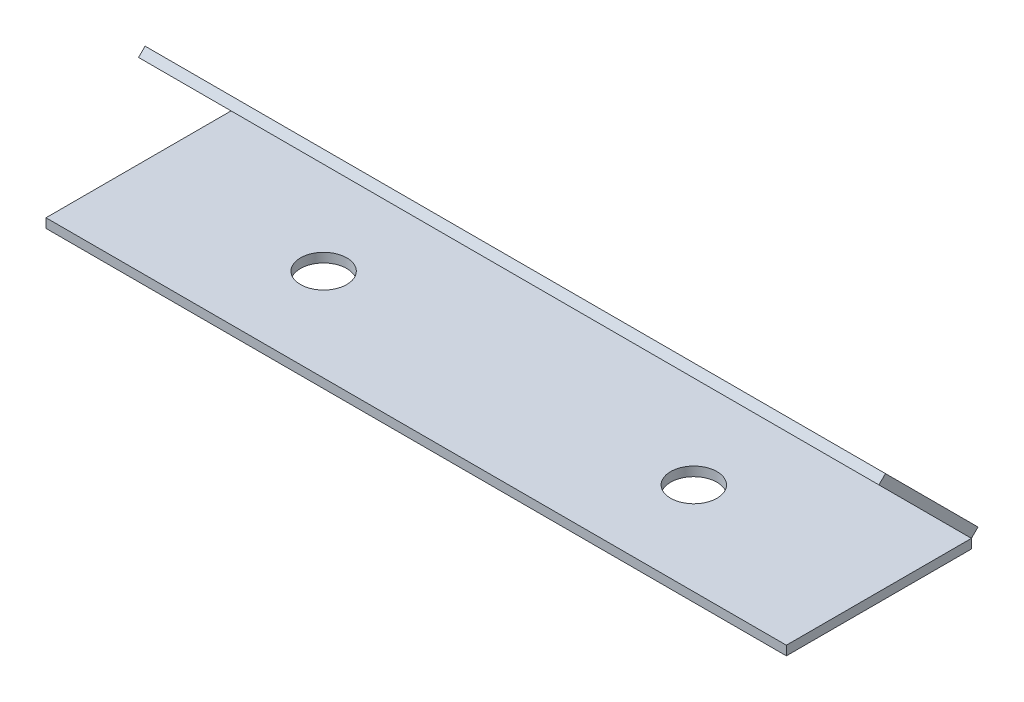
ISO-10303-21;
HEADER;
FILE_DESCRIPTION(('STEP AP214'),'2;1');
FILE_NAME('part.step','',(''),(''),'','','');
FILE_SCHEMA(('AUTOMOTIVE_DESIGN { 1 0 10303 214 1 1 1 1 }'));
ENDSEC;
DATA;
#1=APPLICATION_CONTEXT('core data for automotive mechanical design processes');
#2=APPLICATION_PROTOCOL_DEFINITION('international standard','automotive_design',2000,#1);
#3=PRODUCT_CONTEXT('',#1,'mechanical');
#4=PRODUCT('Part','Part','',(#3));
#5=PRODUCT_RELATED_PRODUCT_CATEGORY('part','',(#4));
#6=PRODUCT_DEFINITION_FORMATION('','',#4);
#7=PRODUCT_DEFINITION_CONTEXT('part definition',#1,'design');
#8=PRODUCT_DEFINITION('design','',#6,#7);
#9=PRODUCT_DEFINITION_SHAPE('','',#8);
#10=(LENGTH_UNIT() NAMED_UNIT(*) SI_UNIT(.MILLI.,.METRE.));
#11=(NAMED_UNIT(*) PLANE_ANGLE_UNIT() SI_UNIT($,.RADIAN.));
#12=(NAMED_UNIT(*) SI_UNIT($,.STERADIAN.) SOLID_ANGLE_UNIT());
#13=UNCERTAINTY_MEASURE_WITH_UNIT(LENGTH_MEASURE(1.E-05),#10,'distance_accuracy_value','');
#14=(GEOMETRIC_REPRESENTATION_CONTEXT(3) GLOBAL_UNCERTAINTY_ASSIGNED_CONTEXT((#13)) GLOBAL_UNIT_ASSIGNED_CONTEXT((#10,
#11,#12)) REPRESENTATION_CONTEXT('',''));
#15=CARTESIAN_POINT('',(0.,0.,0.));
#16=DIRECTION('',(0.,0.,1.));
#17=DIRECTION('',(1.,0.,0.));
#18=AXIS2_PLACEMENT_3D('',#15,#16,#17);
#19=CARTESIAN_POINT('',(0.,1.55177669529664,-1.55177669529664));
#20=DIRECTION('',(0.,0.707106781186546,-0.707106781186549));
#21=DIRECTION('',(0.,0.707106781186549,0.707106781186546));
#22=AXIS2_PLACEMENT_3D('',#19,#20,#21);
#23=PLANE('',#22);
#24=CARTESIAN_POINT('',(4.98869427012494,1.55177669529664,-1.55177669529664));
#25=DIRECTION('',(0.,0.707106781186546,-0.707106781186549));
#26=DIRECTION('',(0.,0.707106781186549,0.707106781186546));
#27=AXIS2_PLACEMENT_3D('',#24,#25,#26);
#28=CIRCLE('',#27,0.625);
#29=CARTESIAN_POINT('',(4.98869427012494,1.99371843353823,-1.10983495705505));
#30=VERTEX_POINT('',#29);
#31=EDGE_CURVE('E120',#30,#30,#28,.T.);
#32=ORIENTED_EDGE('',*,*,#31,.F.);
#33=EDGE_LOOP('',(#32));
#34=FACE_BOUND('',#33,.T.);
#35=DIRECTION('',(0.,-0.707106781186549,-0.707106781186546));
#36=VECTOR('',#35,1.);
#37=CARTESIAN_POINT('',(9.99999999999999,2.92677669529664,-0.176776695296646));
#38=LINE('',#37,#36);
#39=CARTESIAN_POINT('',(9.99999999999999,2.92677669529664,-0.176776695296646));
#40=VERTEX_POINT('',#39);
#41=CARTESIAN_POINT('',(10.,0.426776695296637,-2.67677669529664));
#42=VERTEX_POINT('',#41);
#43=EDGE_CURVE('E105',#40,#42,#38,.T.);
#44=ORIENTED_EDGE('',*,*,#43,.T.);
#45=DIRECTION('',(-1.,0.,0.));
#46=VECTOR('',#45,1.);
#47=CARTESIAN_POINT('',(10.,0.426776695296637,-2.67677669529664));
#48=LINE('',#47,#46);
#49=CARTESIAN_POINT('',(-10.,0.426776695296637,-2.67677669529664));
#50=VERTEX_POINT('',#49);
#51=EDGE_CURVE('E100',#42,#50,#48,.T.);
#52=ORIENTED_EDGE('',*,*,#51,.T.);
#53=DIRECTION('',(0.,0.707106781186549,0.707106781186546));
#54=VECTOR('',#53,1.);
#55=CARTESIAN_POINT('',(-10.,0.426776695296637,-2.67677669529664));
#56=LINE('',#55,#54);
#57=CARTESIAN_POINT('',(-10.,2.92677669529664,-0.176776695296646));
#58=VERTEX_POINT('',#57);
#59=EDGE_CURVE('E103',#50,#58,#56,.T.);
#60=ORIENTED_EDGE('',*,*,#59,.T.);
#61=DIRECTION('',(1.,0.,0.));
#62=VECTOR('',#61,1.);
#63=CARTESIAN_POINT('',(-10.,2.92677669529664,-0.176776695296646));
#64=LINE('',#63,#62);
#65=EDGE_CURVE('E70',#58,#40,#64,.T.);
#66=ORIENTED_EDGE('',*,*,#65,.T.);
#67=EDGE_LOOP('',(#44,#52,#60,#66));
#68=FACE_BOUND('',#67,.T.);
#69=CARTESIAN_POINT('',(-5.01130572987506,1.55177669529664,-1.55177669529664));
#70=DIRECTION('',(0.,0.707106781186546,-0.707106781186549));
#71=DIRECTION('',(0.,0.707106781186549,0.707106781186546));
#72=AXIS2_PLACEMENT_3D('',#69,#70,#71);
#73=CIRCLE('',#72,0.625);
#74=CARTESIAN_POINT('',(-5.01130572987506,1.99371843353823,-1.10983495705505));
#75=VERTEX_POINT('',#74);
#76=EDGE_CURVE('E135',#75,#75,#73,.T.);
#77=ORIENTED_EDGE('',*,*,#76,.F.);
#78=EDGE_LOOP('',(#77));
#79=FACE_BOUND('',#78,.T.);
#80=ADVANCED_FACE('F53',(#34,#68,#79),#23,.T.);
#81=CARTESIAN_POINT('',(0.,1.375,-1.37500000000001));
#82=DIRECTION('',(0.,0.707106781186546,-0.707106781186549));
#83=DIRECTION('',(0.,0.707106781186549,0.707106781186546));
#84=AXIS2_PLACEMENT_3D('',#81,#82,#83);
#85=PLANE('',#84);
#86=DIRECTION('',(0.,-0.707106781186549,-0.707106781186546));
#87=VECTOR('',#86,1.);
#88=CARTESIAN_POINT('',(9.99999999999999,2.75,0.));
#89=LINE('',#88,#87);
#90=CARTESIAN_POINT('',(9.99999999999999,2.75,0.));
#91=VERTEX_POINT('',#90);
#92=CARTESIAN_POINT('',(10.,0.25,-2.5));
#93=VERTEX_POINT('',#92);
#94=EDGE_CURVE('E117',#91,#93,#89,.T.);
#95=ORIENTED_EDGE('',*,*,#94,.F.);
#96=DIRECTION('',(1.,0.,0.));
#97=VECTOR('',#96,1.);
#98=CARTESIAN_POINT('',(-10.,2.75,0.));
#99=LINE('',#98,#97);
#100=CARTESIAN_POINT('',(-10.,2.75,0.));
#101=VERTEX_POINT('',#100);
#102=EDGE_CURVE('E93',#101,#91,#99,.T.);
#103=ORIENTED_EDGE('',*,*,#102,.F.);
#104=DIRECTION('',(0.,0.707106781186549,0.707106781186546));
#105=VECTOR('',#104,1.);
#106=CARTESIAN_POINT('',(-10.,0.25,-2.5));
#107=LINE('',#106,#105);
#108=CARTESIAN_POINT('',(-10.,0.25,-2.5));
#109=VERTEX_POINT('',#108);
#110=EDGE_CURVE('E87',#109,#101,#107,.T.);
#111=ORIENTED_EDGE('',*,*,#110,.F.);
#112=DIRECTION('',(-1.,0.,0.));
#113=VECTOR('',#112,1.);
#114=CARTESIAN_POINT('',(10.,0.25,-2.5));
#115=LINE('',#114,#113);
#116=EDGE_CURVE('E109',#93,#109,#115,.T.);
#117=ORIENTED_EDGE('',*,*,#116,.F.);
#118=EDGE_LOOP('',(#95,#103,#111,#117));
#119=FACE_BOUND('',#118,.T.);
#120=CARTESIAN_POINT('',(4.98869427012494,1.375,-1.375));
#121=DIRECTION('',(0.,0.707106781186546,-0.707106781186549));
#122=DIRECTION('',(0.,0.707106781186549,0.707106781186546));
#123=AXIS2_PLACEMENT_3D('',#120,#121,#122);
#124=CIRCLE('',#123,0.625);
#125=CARTESIAN_POINT('',(4.98869427012494,1.81694173824159,-0.933058261758414));
#126=VERTEX_POINT('',#125);
#127=EDGE_CURVE('E132',#126,#126,#124,.T.);
#128=ORIENTED_EDGE('',*,*,#127,.T.);
#129=EDGE_LOOP('',(#128));
#130=FACE_BOUND('',#129,.T.);
#131=CARTESIAN_POINT('',(-5.01130572987506,1.375,-1.375));
#132=DIRECTION('',(0.,0.707106781186546,-0.707106781186549));
#133=DIRECTION('',(0.,0.707106781186549,0.707106781186546));
#134=AXIS2_PLACEMENT_3D('',#131,#132,#133);
#135=CIRCLE('',#134,0.625);
#136=CARTESIAN_POINT('',(-5.01130572987506,1.81694173824159,-0.933058261758414));
#137=VERTEX_POINT('',#136);
#138=EDGE_CURVE('E138',#137,#137,#135,.T.);
#139=ORIENTED_EDGE('',*,*,#138,.T.);
#140=EDGE_LOOP('',(#139));
#141=FACE_BOUND('',#140,.T.);
#142=ADVANCED_FACE('F128',(#119,#130,#141),#85,.F.);
#143=CARTESIAN_POINT('',(9.99999999999999,2.92677669529664,-0.176776695296646));
#144=DIRECTION('',(-1.,0.,0.));
#145=DIRECTION('',(0.,-1.,0.));
#146=AXIS2_PLACEMENT_3D('',#143,#144,#145);
#147=PLANE('',#146);
#148=ORIENTED_EDGE('',*,*,#94,.T.);
#149=DIRECTION('',(0.,-0.707106781186546,0.707106781186549));
#150=VECTOR('',#149,1.);
#151=CARTESIAN_POINT('',(10.,0.426776695296637,-2.67677669529664));
#152=LINE('',#151,#150);
#153=EDGE_CURVE('E12',#42,#93,#152,.T.);
#154=ORIENTED_EDGE('',*,*,#153,.F.);
#155=ORIENTED_EDGE('',*,*,#43,.F.);
#156=DIRECTION('',(0.,-0.707106781186546,0.707106781186549));
#157=VECTOR('',#156,1.);
#158=CARTESIAN_POINT('',(9.99999999999999,2.92677669529664,-0.176776695296646));
#159=LINE('',#158,#157);
#160=EDGE_CURVE('E113',#40,#91,#159,.T.);
#161=ORIENTED_EDGE('',*,*,#160,.T.);
#162=EDGE_LOOP('',(#148,#154,#155,#161));
#163=FACE_BOUND('',#162,.T.);
#164=ADVANCED_FACE('F55',(#163),#147,.F.);
#165=CARTESIAN_POINT('',(10.,0.426776695296637,-2.67677669529664));
#166=DIRECTION('',(0.,0.707106781186549,0.707106781186546));
#167=DIRECTION('',(0.,-0.707106781186546,0.707106781186549));
#168=AXIS2_PLACEMENT_3D('',#165,#166,#167);
#169=PLANE('',#168);
#170=ORIENTED_EDGE('',*,*,#116,.T.);
#171=DIRECTION('',(0.,-0.707106781186546,0.707106781186549));
#172=VECTOR('',#171,1.);
#173=CARTESIAN_POINT('',(-10.,0.426776695296637,-2.67677669529664));
#174=LINE('',#173,#172);
#175=EDGE_CURVE('E62',#50,#109,#174,.T.);
#176=ORIENTED_EDGE('',*,*,#175,.F.);
#177=ORIENTED_EDGE('',*,*,#51,.F.);
#178=ORIENTED_EDGE('',*,*,#153,.T.);
#179=EDGE_LOOP('',(#170,#176,#177,#178));
#180=FACE_BOUND('',#179,.T.);
#181=ADVANCED_FACE('F108',(#180),#169,.F.);
#182=CARTESIAN_POINT('',(-10.,0.426776695296637,-2.67677669529664));
#183=DIRECTION('',(1.,0.,0.));
#184=DIRECTION('',(0.,0.,-1.));
#185=AXIS2_PLACEMENT_3D('',#182,#183,#184);
#186=PLANE('',#185);
#187=ORIENTED_EDGE('',*,*,#110,.T.);
#188=DIRECTION('',(0.,-0.707106781186546,0.707106781186549));
#189=VECTOR('',#188,1.);
#190=CARTESIAN_POINT('',(-10.,2.92677669529664,-0.176776695296646));
#191=LINE('',#190,#189);
#192=EDGE_CURVE('E110',#58,#101,#191,.T.);
#193=ORIENTED_EDGE('',*,*,#192,.F.);
#194=ORIENTED_EDGE('',*,*,#59,.F.);
#195=ORIENTED_EDGE('',*,*,#175,.T.);
#196=EDGE_LOOP('',(#187,#193,#194,#195));
#197=FACE_BOUND('',#196,.T.);
#198=ADVANCED_FACE('F111',(#197),#186,.F.);
#199=CARTESIAN_POINT('',(-10.,2.92677669529664,-0.176776695296646));
#200=DIRECTION('',(0.,-0.707106781186549,-0.707106781186546));
#201=DIRECTION('',(0.,0.707106781186546,-0.707106781186549));
#202=AXIS2_PLACEMENT_3D('',#199,#200,#201);
#203=PLANE('',#202);
#204=ORIENTED_EDGE('',*,*,#102,.T.);
#205=ORIENTED_EDGE('',*,*,#160,.F.);
#206=ORIENTED_EDGE('',*,*,#65,.F.);
#207=ORIENTED_EDGE('',*,*,#192,.T.);
#208=EDGE_LOOP('',(#204,#205,#206,#207));
#209=FACE_BOUND('',#208,.T.);
#210=ADVANCED_FACE('F125',(#209),#203,.F.);
#211=CARTESIAN_POINT('',(4.98869427012494,1.55177669529664,-1.55177669529664));
#212=DIRECTION('',(0.,-0.707106781186546,0.707106781186549));
#213=DIRECTION('',(0.,-0.707106781186549,-0.707106781186546));
#214=AXIS2_PLACEMENT_3D('',#211,#212,#213);
#215=CYLINDRICAL_SURFACE('',#214,0.625);
#216=ORIENTED_EDGE('',*,*,#31,.T.);
#217=EDGE_LOOP('',(#216));
#218=FACE_BOUND('',#217,.T.);
#219=ORIENTED_EDGE('',*,*,#127,.F.);
#220=EDGE_LOOP('',(#219));
#221=FACE_BOUND('',#220,.T.);
#222=ADVANCED_FACE('F155',(#218,#221),#215,.F.);
#223=CARTESIAN_POINT('',(-5.01130572987506,1.55177669529664,-1.55177669529664));
#224=DIRECTION('',(0.,-0.707106781186546,0.707106781186549));
#225=DIRECTION('',(0.,-0.707106781186549,-0.707106781186546));
#226=AXIS2_PLACEMENT_3D('',#223,#224,#225);
#227=CYLINDRICAL_SURFACE('',#226,0.625);
#228=ORIENTED_EDGE('',*,*,#76,.T.);
#229=EDGE_LOOP('',(#228));
#230=FACE_BOUND('',#229,.T.);
#231=ORIENTED_EDGE('',*,*,#138,.F.);
#232=EDGE_LOOP('',(#231));
#233=FACE_BOUND('',#232,.T.);
#234=ADVANCED_FACE('F144',(#230,#233),#227,.F.);
#235=CLOSED_SHELL('',(#80,#142,#164,#181,#198,#210,#222,#234));
#236=MANIFOLD_SOLID_BREP('B2',#235);
#237=CARTESIAN_POINT('',(0.,0.25,0.));
#238=DIRECTION('',(0.,1.,0.));
#239=DIRECTION('',(0.,0.,1.));
#240=AXIS2_PLACEMENT_3D('',#237,#238,#239);
#241=PLANE('',#240);
#242=CARTESIAN_POINT('',(-5.,0.25,0.));
#243=DIRECTION('',(0.,1.,0.));
#244=DIRECTION('',(0.,0.,1.));
#245=AXIS2_PLACEMENT_3D('',#242,#243,#244);
#246=CIRCLE('',#245,0.625);
#247=CARTESIAN_POINT('',(-5.,0.25,0.625));
#248=VERTEX_POINT('',#247);
#249=EDGE_CURVE('E308',#248,#248,#246,.T.);
#250=ORIENTED_EDGE('',*,*,#249,.F.);
#251=EDGE_LOOP('',(#250));
#252=FACE_BOUND('',#251,.T.);
#253=DIRECTION('',(0.,0.,-1.));
#254=VECTOR('',#253,1.);
#255=CARTESIAN_POINT('',(10.,0.25,-2.5));
#256=LINE('',#255,#254);
#257=CARTESIAN_POINT('',(9.99999999999999,0.25,2.5));
#258=VERTEX_POINT('',#257);
#259=CARTESIAN_POINT('',(10.,0.25,-2.5));
#260=VERTEX_POINT('',#259);
#261=EDGE_CURVE('E288',#258,#260,#256,.T.);
#262=ORIENTED_EDGE('',*,*,#261,.T.);
#263=DIRECTION('',(-1.,0.,0.));
#264=VECTOR('',#263,1.);
#265=CARTESIAN_POINT('',(-10.,0.25,-2.5));
#266=LINE('',#265,#264);
#267=CARTESIAN_POINT('',(-10.,0.25,-2.5));
#268=VERTEX_POINT('',#267);
#269=EDGE_CURVE('E283',#260,#268,#266,.T.);
#270=ORIENTED_EDGE('',*,*,#269,.T.);
#271=DIRECTION('',(0.,0.,1.));
#272=VECTOR('',#271,1.);
#273=CARTESIAN_POINT('',(-10.,0.25,-2.5));
#274=LINE('',#273,#272);
#275=CARTESIAN_POINT('',(-10.,0.25,2.5));
#276=VERTEX_POINT('',#275);
#277=EDGE_CURVE('E286',#268,#276,#274,.T.);
#278=ORIENTED_EDGE('',*,*,#277,.T.);
#279=DIRECTION('',(1.,0.,0.));
#280=VECTOR('',#279,1.);
#281=CARTESIAN_POINT('',(-10.,0.25,2.5));
#282=LINE('',#281,#280);
#283=EDGE_CURVE('E253',#276,#258,#282,.T.);
#284=ORIENTED_EDGE('',*,*,#283,.T.);
#285=EDGE_LOOP('',(#262,#270,#278,#284));
#286=FACE_BOUND('',#285,.T.);
#287=CARTESIAN_POINT('',(5.,0.25,0.));
#288=DIRECTION('',(0.,1.,0.));
#289=DIRECTION('',(0.,0.,1.));
#290=AXIS2_PLACEMENT_3D('',#287,#288,#289);
#291=CIRCLE('',#290,0.625);
#292=CARTESIAN_POINT('',(5.,0.25,0.625));
#293=VERTEX_POINT('',#292);
#294=EDGE_CURVE('E330',#293,#293,#291,.T.);
#295=ORIENTED_EDGE('',*,*,#294,.F.);
#296=EDGE_LOOP('',(#295));
#297=FACE_BOUND('',#296,.T.);
#298=ADVANCED_FACE('F235',(#252,#286,#297),#241,.T.);
#299=CARTESIAN_POINT('',(0.,0.,0.));
#300=DIRECTION('',(0.,1.,0.));
#301=DIRECTION('',(0.,0.,1.));
#302=AXIS2_PLACEMENT_3D('',#299,#300,#301);
#303=PLANE('',#302);
#304=DIRECTION('',(0.,0.,-1.));
#305=VECTOR('',#304,1.);
#306=CARTESIAN_POINT('',(10.,0.,-2.5));
#307=LINE('',#306,#305);
#308=CARTESIAN_POINT('',(9.99999999999999,0.,2.5));
#309=VERTEX_POINT('',#308);
#310=CARTESIAN_POINT('',(10.,0.,-2.5));
#311=VERTEX_POINT('',#310);
#312=EDGE_CURVE('E304',#309,#311,#307,.T.);
#313=ORIENTED_EDGE('',*,*,#312,.F.);
#314=DIRECTION('',(1.,0.,0.));
#315=VECTOR('',#314,1.);
#316=CARTESIAN_POINT('',(-10.,0.,2.5));
#317=LINE('',#316,#315);
#318=CARTESIAN_POINT('',(-10.,0.,2.5));
#319=VERTEX_POINT('',#318);
#320=EDGE_CURVE('E276',#319,#309,#317,.T.);
#321=ORIENTED_EDGE('',*,*,#320,.F.);
#322=DIRECTION('',(0.,0.,1.));
#323=VECTOR('',#322,1.);
#324=CARTESIAN_POINT('',(-10.,0.,-2.5));
#325=LINE('',#324,#323);
#326=CARTESIAN_POINT('',(-10.,0.,-2.5));
#327=VERTEX_POINT('',#326);
#328=EDGE_CURVE('E270',#327,#319,#325,.T.);
#329=ORIENTED_EDGE('',*,*,#328,.F.);
#330=DIRECTION('',(-1.,0.,0.));
#331=VECTOR('',#330,1.);
#332=CARTESIAN_POINT('',(-10.,0.,-2.5));
#333=LINE('',#332,#331);
#334=EDGE_CURVE('E293',#311,#327,#333,.T.);
#335=ORIENTED_EDGE('',*,*,#334,.F.);
#336=EDGE_LOOP('',(#313,#321,#329,#335));
#337=FACE_BOUND('',#336,.T.);
#338=CARTESIAN_POINT('',(-5.,0.,0.));
#339=DIRECTION('',(0.,1.,0.));
#340=DIRECTION('',(0.,0.,1.));
#341=AXIS2_PLACEMENT_3D('',#338,#339,#340);
#342=CIRCLE('',#341,0.625);
#343=CARTESIAN_POINT('',(-5.,0.,0.625));
#344=VERTEX_POINT('',#343);
#345=EDGE_CURVE('E326',#344,#344,#342,.T.);
#346=ORIENTED_EDGE('',*,*,#345,.T.);
#347=EDGE_LOOP('',(#346));
#348=FACE_BOUND('',#347,.T.);
#349=CARTESIAN_POINT('',(5.,0.,0.));
#350=DIRECTION('',(0.,1.,0.));
#351=DIRECTION('',(0.,0.,1.));
#352=AXIS2_PLACEMENT_3D('',#349,#350,#351);
#353=CIRCLE('',#352,0.625);
#354=CARTESIAN_POINT('',(5.,0.,0.625));
#355=VERTEX_POINT('',#354);
#356=EDGE_CURVE('E334',#355,#355,#353,.T.);
#357=ORIENTED_EDGE('',*,*,#356,.T.);
#358=EDGE_LOOP('',(#357));
#359=FACE_BOUND('',#358,.T.);
#360=ADVANCED_FACE('F321',(#337,#348,#359),#303,.F.);
#361=CARTESIAN_POINT('',(10.,0.25,-2.5));
#362=DIRECTION('',(-1.,0.,0.));
#363=DIRECTION('',(0.,0.,1.));
#364=AXIS2_PLACEMENT_3D('',#361,#362,#363);
#365=PLANE('',#364);
#366=ORIENTED_EDGE('',*,*,#312,.T.);
#367=DIRECTION('',(0.,-1.,0.));
#368=VECTOR('',#367,1.);
#369=CARTESIAN_POINT('',(10.,0.25,-2.5));
#370=LINE('',#369,#368);
#371=EDGE_CURVE('E51',#260,#311,#370,.T.);
#372=ORIENTED_EDGE('',*,*,#371,.F.);
#373=ORIENTED_EDGE('',*,*,#261,.F.);
#374=DIRECTION('',(0.,-1.,0.));
#375=VECTOR('',#374,1.);
#376=CARTESIAN_POINT('',(9.99999999999999,0.25,2.5));
#377=LINE('',#376,#375);
#378=EDGE_CURVE('E300',#258,#309,#377,.T.);
#379=ORIENTED_EDGE('',*,*,#378,.T.);
#380=EDGE_LOOP('',(#366,#372,#373,#379));
#381=FACE_BOUND('',#380,.T.);
#382=ADVANCED_FACE('F237',(#381),#365,.F.);
#383=CARTESIAN_POINT('',(-10.,0.25,-2.5));
#384=DIRECTION('',(0.,0.,1.));
#385=DIRECTION('',(1.,0.,0.));
#386=AXIS2_PLACEMENT_3D('',#383,#384,#385);
#387=PLANE('',#386);
#388=ORIENTED_EDGE('',*,*,#334,.T.);
#389=DIRECTION('',(0.,-1.,0.));
#390=VECTOR('',#389,1.);
#391=CARTESIAN_POINT('',(-10.,0.25,-2.5));
#392=LINE('',#391,#390);
#393=EDGE_CURVE('E245',#268,#327,#392,.T.);
#394=ORIENTED_EDGE('',*,*,#393,.F.);
#395=ORIENTED_EDGE('',*,*,#269,.F.);
#396=ORIENTED_EDGE('',*,*,#371,.T.);
#397=EDGE_LOOP('',(#388,#394,#395,#396));
#398=FACE_BOUND('',#397,.T.);
#399=ADVANCED_FACE('F292',(#398),#387,.F.);
#400=CARTESIAN_POINT('',(-10.,0.25,-2.5));
#401=DIRECTION('',(1.,0.,0.));
#402=DIRECTION('',(0.,0.,-1.));
#403=AXIS2_PLACEMENT_3D('',#400,#401,#402);
#404=PLANE('',#403);
#405=ORIENTED_EDGE('',*,*,#328,.T.);
#406=DIRECTION('',(0.,-1.,0.));
#407=VECTOR('',#406,1.);
#408=CARTESIAN_POINT('',(-10.,0.25,2.5));
#409=LINE('',#408,#407);
#410=EDGE_CURVE('E295',#276,#319,#409,.T.);
#411=ORIENTED_EDGE('',*,*,#410,.F.);
#412=ORIENTED_EDGE('',*,*,#277,.F.);
#413=ORIENTED_EDGE('',*,*,#393,.T.);
#414=EDGE_LOOP('',(#405,#411,#412,#413));
#415=FACE_BOUND('',#414,.T.);
#416=ADVANCED_FACE('F296',(#415),#404,.F.);
#417=CARTESIAN_POINT('',(-10.,0.25,2.5));
#418=DIRECTION('',(0.,0.,-1.));
#419=DIRECTION('',(-1.,0.,0.));
#420=AXIS2_PLACEMENT_3D('',#417,#418,#419);
#421=PLANE('',#420);
#422=ORIENTED_EDGE('',*,*,#320,.T.);
#423=ORIENTED_EDGE('',*,*,#378,.F.);
#424=ORIENTED_EDGE('',*,*,#283,.F.);
#425=ORIENTED_EDGE('',*,*,#410,.T.);
#426=EDGE_LOOP('',(#422,#423,#424,#425));
#427=FACE_BOUND('',#426,.T.);
#428=ADVANCED_FACE('F318',(#427),#421,.F.);
#429=CARTESIAN_POINT('',(-5.,0.25,0.));
#430=DIRECTION('',(0.,-1.,0.));
#431=DIRECTION('',(0.,0.,-1.));
#432=AXIS2_PLACEMENT_3D('',#429,#430,#431);
#433=CYLINDRICAL_SURFACE('',#432,0.625);
#434=ORIENTED_EDGE('',*,*,#249,.T.);
#435=EDGE_LOOP('',(#434));
#436=FACE_BOUND('',#435,.T.);
#437=ORIENTED_EDGE('',*,*,#345,.F.);
#438=EDGE_LOOP('',(#437));
#439=FACE_BOUND('',#438,.T.);
#440=ADVANCED_FACE('F353',(#436,#439),#433,.F.);
#441=CARTESIAN_POINT('',(5.,0.25,0.));
#442=DIRECTION('',(0.,-1.,0.));
#443=DIRECTION('',(0.,0.,-1.));
#444=AXIS2_PLACEMENT_3D('',#441,#442,#443);
#445=CYLINDRICAL_SURFACE('',#444,0.625);
#446=ORIENTED_EDGE('',*,*,#294,.T.);
#447=EDGE_LOOP('',(#446));
#448=FACE_BOUND('',#447,.T.);
#449=ORIENTED_EDGE('',*,*,#356,.F.);
#450=EDGE_LOOP('',(#449));
#451=FACE_BOUND('',#450,.T.);
#452=ADVANCED_FACE('F342',(#448,#451),#445,.F.);
#453=CLOSED_SHELL('',(#298,#360,#382,#399,#416,#428,#440,#452));
#454=MANIFOLD_SOLID_BREP('B6',#453);
#455=ADVANCED_BREP_SHAPE_REPRESENTATION('',(#18,#236,#454),#14);
#456=SHAPE_DEFINITION_REPRESENTATION(#9,#455);
ENDSEC;
END-ISO-10303-21;
